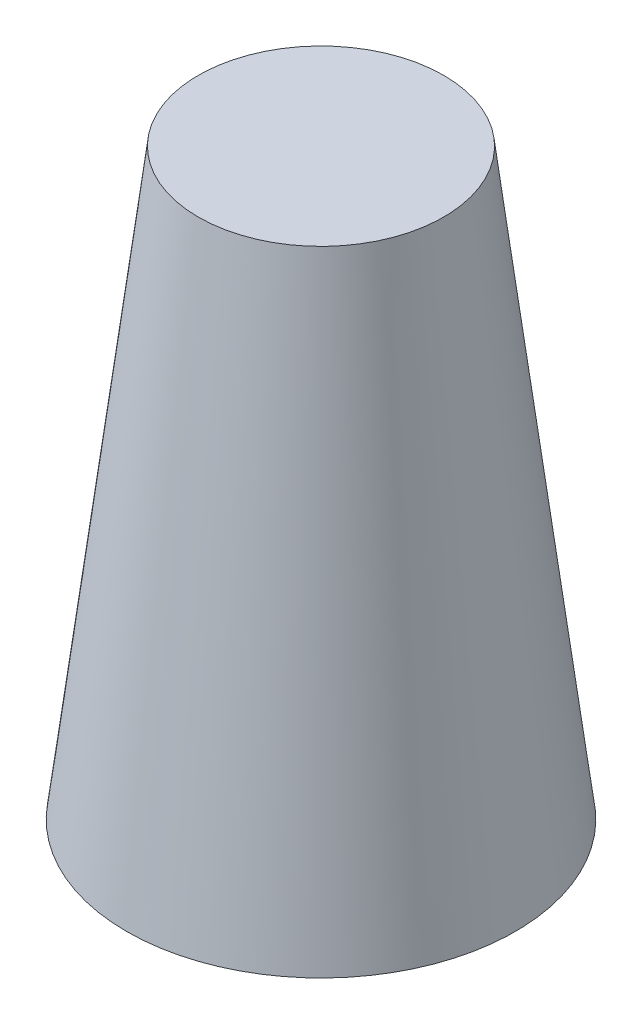
ISO-10303-21;
HEADER;
FILE_DESCRIPTION(('STEP AP214'),'2;1');
FILE_NAME('part.step','',(''),(''),'','','');
FILE_SCHEMA(('AUTOMOTIVE_DESIGN { 1 0 10303 214 1 1 1 1 }'));
ENDSEC;
DATA;
#1=APPLICATION_CONTEXT('core data for automotive mechanical design processes');
#2=APPLICATION_PROTOCOL_DEFINITION('international standard','automotive_design',2000,#1);
#3=PRODUCT_CONTEXT('',#1,'mechanical');
#4=PRODUCT('Part','Part','',(#3));
#5=PRODUCT_RELATED_PRODUCT_CATEGORY('part','',(#4));
#6=PRODUCT_DEFINITION_FORMATION('','',#4);
#7=PRODUCT_DEFINITION_CONTEXT('part definition',#1,'design');
#8=PRODUCT_DEFINITION('design','',#6,#7);
#9=PRODUCT_DEFINITION_SHAPE('','',#8);
#10=(LENGTH_UNIT() NAMED_UNIT(*) SI_UNIT(.MILLI.,.METRE.));
#11=(NAMED_UNIT(*) PLANE_ANGLE_UNIT() SI_UNIT($,.RADIAN.));
#12=(NAMED_UNIT(*) SI_UNIT($,.STERADIAN.) SOLID_ANGLE_UNIT());
#13=UNCERTAINTY_MEASURE_WITH_UNIT(LENGTH_MEASURE(1.E-05),#10,'distance_accuracy_value','');
#14=(GEOMETRIC_REPRESENTATION_CONTEXT(3) GLOBAL_UNCERTAINTY_ASSIGNED_CONTEXT((#13)) GLOBAL_UNIT_ASSIGNED_CONTEXT((#10,
#11,#12)) REPRESENTATION_CONTEXT('',''));
#15=CARTESIAN_POINT('',(0.,0.,0.));
#16=DIRECTION('',(0.,0.,1.));
#17=DIRECTION('',(1.,0.,0.));
#18=AXIS2_PLACEMENT_3D('',#15,#16,#17);
#19=CARTESIAN_POINT('',(0.,0.,0.));
#20=DIRECTION('',(0.,-1.,0.));
#21=DIRECTION('',(0.,0.,1.));
#22=AXIS2_PLACEMENT_3D('',#19,#20,#21);
#23=CONICAL_SURFACE('',#22,0.635,0.122173047639603);
#24=CARTESIAN_POINT('',(0.,1.905,0.));
#25=DIRECTION('',(0.,1.,0.));
#26=DIRECTION('',(0.,0.,1.));
#27=AXIS2_PLACEMENT_3D('',#24,#25,#26);
#28=CIRCLE('',#27,0.401095411479966);
#29=CARTESIAN_POINT('',(0.,1.905,0.401095411479966));
#30=VERTEX_POINT('',#29);
#31=EDGE_CURVE('E10',#30,#30,#28,.T.);
#32=ORIENTED_EDGE('',*,*,#31,.F.);
#33=EDGE_LOOP('',(#32));
#34=FACE_BOUND('',#33,.T.);
#35=CARTESIAN_POINT('',(0.,0.,0.));
#36=DIRECTION('',(0.,1.,0.));
#37=DIRECTION('',(0.,0.,1.));
#38=AXIS2_PLACEMENT_3D('',#35,#36,#37);
#39=CIRCLE('',#38,0.635);
#40=CARTESIAN_POINT('',(0.,0.,0.635));
#41=VERTEX_POINT('',#40);
#42=EDGE_CURVE('E37',#41,#41,#39,.T.);
#43=ORIENTED_EDGE('',*,*,#42,.T.);
#44=EDGE_LOOP('',(#43));
#45=FACE_BOUND('',#44,.T.);
#46=ADVANCED_FACE('F31',(#34,#45),#23,.T.);
#47=CARTESIAN_POINT('',(0.,1.905,0.));
#48=DIRECTION('',(0.,1.,0.));
#49=DIRECTION('',(0.,0.,1.));
#50=AXIS2_PLACEMENT_3D('',#47,#48,#49);
#51=PLANE('',#50);
#52=ORIENTED_EDGE('',*,*,#31,.T.);
#53=EDGE_LOOP('',(#52));
#54=FACE_BOUND('',#53,.T.);
#55=ADVANCED_FACE('F46',(#54),#51,.T.);
#56=CARTESIAN_POINT('',(0.,0.,0.));
#57=DIRECTION('',(0.,1.,0.));
#58=DIRECTION('',(0.,0.,1.));
#59=AXIS2_PLACEMENT_3D('',#56,#57,#58);
#60=PLANE('',#59);
#61=ORIENTED_EDGE('',*,*,#42,.F.);
#62=EDGE_LOOP('',(#61));
#63=FACE_BOUND('',#62,.T.);
#64=ADVANCED_FACE('F44',(#63),#60,.F.);
#65=CLOSED_SHELL('',(#46,#55,#64));
#66=MANIFOLD_SOLID_BREP('B2',#65);
#67=ADVANCED_BREP_SHAPE_REPRESENTATION('',(#18,#66),#14);
#68=SHAPE_DEFINITION_REPRESENTATION(#9,#67);
ENDSEC;
END-ISO-10303-21;
